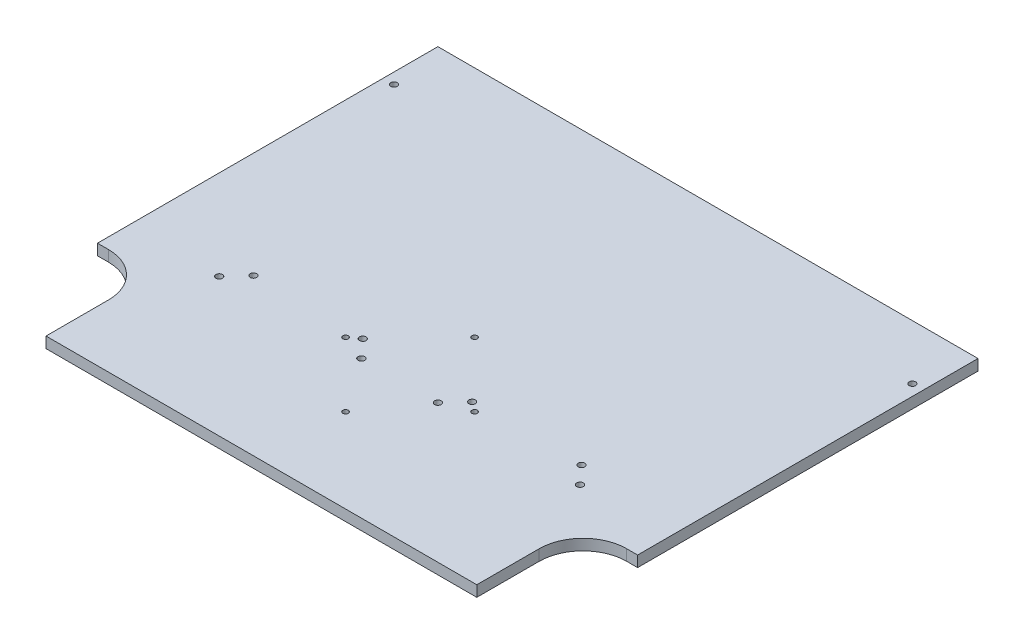
ISO-10303-21;
HEADER;
FILE_DESCRIPTION(('STEP AP214'),'2;1');
FILE_NAME('part.step','',(''),(''),'','','');
FILE_SCHEMA(('AUTOMOTIVE_DESIGN { 1 0 10303 214 1 1 1 1 }'));
ENDSEC;
DATA;
#1=APPLICATION_CONTEXT('core data for automotive mechanical design processes');
#2=APPLICATION_PROTOCOL_DEFINITION('international standard','automotive_design',2000,#1);
#3=PRODUCT_CONTEXT('',#1,'mechanical');
#4=PRODUCT('Part','Part','',(#3));
#5=PRODUCT_RELATED_PRODUCT_CATEGORY('part','',(#4));
#6=PRODUCT_DEFINITION_FORMATION('','',#4);
#7=PRODUCT_DEFINITION_CONTEXT('part definition',#1,'design');
#8=PRODUCT_DEFINITION('design','',#6,#7);
#9=PRODUCT_DEFINITION_SHAPE('','',#8);
#10=(LENGTH_UNIT() NAMED_UNIT(*) SI_UNIT(.MILLI.,.METRE.));
#11=(NAMED_UNIT(*) PLANE_ANGLE_UNIT() SI_UNIT($,.RADIAN.));
#12=(NAMED_UNIT(*) SI_UNIT($,.STERADIAN.) SOLID_ANGLE_UNIT());
#13=UNCERTAINTY_MEASURE_WITH_UNIT(LENGTH_MEASURE(1.E-05),#10,'distance_accuracy_value','');
#14=(GEOMETRIC_REPRESENTATION_CONTEXT(3) GLOBAL_UNCERTAINTY_ASSIGNED_CONTEXT((#13)) GLOBAL_UNIT_ASSIGNED_CONTEXT((#10,
#11,#12)) REPRESENTATION_CONTEXT('',''));
#15=CARTESIAN_POINT('',(0.,0.,0.));
#16=DIRECTION('',(0.,0.,1.));
#17=DIRECTION('',(1.,0.,0.));
#18=AXIS2_PLACEMENT_3D('',#15,#16,#17);
#19=CARTESIAN_POINT('',(123.5,-5.,119.46488064494));
#20=DIRECTION('',(0.,0.,1.));
#21=DIRECTION('',(1.,0.,0.));
#22=AXIS2_PLACEMENT_3D('',#19,#20,#21);
#23=PLANE('',#22);
#24=DIRECTION('',(1.,0.,0.));
#25=VECTOR('',#24,1.);
#26=CARTESIAN_POINT('',(123.5,0.,119.46488064494));
#27=LINE('',#26,#25);
#28=CARTESIAN_POINT('',(118.5,0.,119.46488064494));
#29=VERTEX_POINT('',#28);
#30=CARTESIAN_POINT('',(123.5,0.,119.46488064494));
#31=VERTEX_POINT('',#30);
#32=EDGE_CURVE('E142',#29,#31,#27,.T.);
#33=ORIENTED_EDGE('',*,*,#32,.F.);
#34=DIRECTION('',(0.,1.,0.));
#35=VECTOR('',#34,1.);
#36=CARTESIAN_POINT('',(118.5,-5.,119.46488064494));
#37=LINE('',#36,#35);
#38=CARTESIAN_POINT('',(118.5,-5.,119.46488064494));
#39=VERTEX_POINT('',#38);
#40=EDGE_CURVE('E11',#39,#29,#37,.T.);
#41=ORIENTED_EDGE('',*,*,#40,.F.);
#42=DIRECTION('',(1.,0.,0.));
#43=VECTOR('',#42,1.);
#44=CARTESIAN_POINT('',(123.5,-5.,119.46488064494));
#45=LINE('',#44,#43);
#46=CARTESIAN_POINT('',(123.5,-5.,119.46488064494));
#47=VERTEX_POINT('',#46);
#48=EDGE_CURVE('E169',#39,#47,#45,.T.);
#49=ORIENTED_EDGE('',*,*,#48,.T.);
#50=DIRECTION('',(0.,1.,0.));
#51=VECTOR('',#50,1.);
#52=CARTESIAN_POINT('',(123.5,-5.,119.46488064494));
#53=LINE('',#52,#51);
#54=EDGE_CURVE('E94',#47,#31,#53,.T.);
#55=ORIENTED_EDGE('',*,*,#54,.T.);
#56=EDGE_LOOP('',(#33,#41,#49,#55));
#57=FACE_BOUND('',#56,.T.);
#58=ADVANCED_FACE('F32',(#57),#23,.T.);
#59=CARTESIAN_POINT('',(118.5,-5.,139.46488064494));
#60=DIRECTION('',(0.,1.,0.));
#61=DIRECTION('',(0.,0.,1.));
#62=AXIS2_PLACEMENT_3D('',#59,#60,#61);
#63=CYLINDRICAL_SURFACE('',#62,20.);
#64=CARTESIAN_POINT('',(118.5,0.,139.46488064494));
#65=DIRECTION('',(0.,-1.,0.));
#66=DIRECTION('',(0.,0.,1.));
#67=AXIS2_PLACEMENT_3D('',#64,#65,#66);
#68=CIRCLE('',#67,20.);
#69=CARTESIAN_POINT('',(98.4999999999999,0.,139.46488064494));
#70=VERTEX_POINT('',#69);
#71=EDGE_CURVE('E167',#70,#29,#68,.T.);
#72=ORIENTED_EDGE('',*,*,#71,.F.);
#73=DIRECTION('',(0.,1.,0.));
#74=VECTOR('',#73,1.);
#75=CARTESIAN_POINT('',(98.4999999999999,-5.,139.46488064494));
#76=LINE('',#75,#74);
#77=CARTESIAN_POINT('',(98.4999999999999,-5.,139.46488064494));
#78=VERTEX_POINT('',#77);
#79=EDGE_CURVE('E41',#78,#70,#76,.T.);
#80=ORIENTED_EDGE('',*,*,#79,.F.);
#81=CARTESIAN_POINT('',(118.5,-5.,139.46488064494));
#82=DIRECTION('',(0.,-1.,0.));
#83=DIRECTION('',(0.,0.,1.));
#84=AXIS2_PLACEMENT_3D('',#81,#82,#83);
#85=CIRCLE('',#84,20.);
#86=EDGE_CURVE('E132',#78,#39,#85,.T.);
#87=ORIENTED_EDGE('',*,*,#86,.T.);
#88=ORIENTED_EDGE('',*,*,#40,.T.);
#89=EDGE_LOOP('',(#72,#80,#87,#88));
#90=FACE_BOUND('',#89,.T.);
#91=ADVANCED_FACE('F293',(#90),#63,.F.);
#92=CARTESIAN_POINT('',(98.4999999999999,-5.,139.46488064494));
#93=DIRECTION('',(1.,0.,0.));
#94=DIRECTION('',(0.,0.,-1.));
#95=AXIS2_PLACEMENT_3D('',#92,#93,#94);
#96=PLANE('',#95);
#97=DIRECTION('',(0.,0.,-1.));
#98=VECTOR('',#97,1.);
#99=CARTESIAN_POINT('',(98.4999999999999,0.,139.46488064494));
#100=LINE('',#99,#98);
#101=CARTESIAN_POINT('',(98.4999999999999,0.,168.));
#102=VERTEX_POINT('',#101);
#103=EDGE_CURVE('E119',#102,#70,#100,.T.);
#104=ORIENTED_EDGE('',*,*,#103,.F.);
#105=DIRECTION('',(0.,1.,0.));
#106=VECTOR('',#105,1.);
#107=CARTESIAN_POINT('',(98.4999999999999,-5.,168.));
#108=LINE('',#107,#106);
#109=CARTESIAN_POINT('',(98.4999999999999,-5.,168.));
#110=VERTEX_POINT('',#109);
#111=EDGE_CURVE('E114',#110,#102,#108,.T.);
#112=ORIENTED_EDGE('',*,*,#111,.F.);
#113=DIRECTION('',(0.,0.,-1.));
#114=VECTOR('',#113,1.);
#115=CARTESIAN_POINT('',(98.4999999999999,-5.,139.46488064494));
#116=LINE('',#115,#114);
#117=EDGE_CURVE('E117',#110,#78,#116,.T.);
#118=ORIENTED_EDGE('',*,*,#117,.T.);
#119=ORIENTED_EDGE('',*,*,#79,.T.);
#120=EDGE_LOOP('',(#104,#112,#118,#119));
#121=FACE_BOUND('',#120,.T.);
#122=ADVANCED_FACE('F116',(#121),#96,.T.);
#123=CARTESIAN_POINT('',(98.4999999999999,-5.,168.));
#124=DIRECTION('',(0.,0.,1.));
#125=DIRECTION('',(1.,0.,0.));
#126=AXIS2_PLACEMENT_3D('',#123,#124,#125);
#127=PLANE('',#126);
#128=DIRECTION('',(1.,0.,0.));
#129=VECTOR('',#128,1.);
#130=CARTESIAN_POINT('',(98.4999999999999,0.,168.));
#131=LINE('',#130,#129);
#132=CARTESIAN_POINT('',(-98.4999999999998,0.,168.));
#133=VERTEX_POINT('',#132);
#134=EDGE_CURVE('E164',#133,#102,#131,.T.);
#135=ORIENTED_EDGE('',*,*,#134,.F.);
#136=DIRECTION('',(0.,1.,0.));
#137=VECTOR('',#136,1.);
#138=CARTESIAN_POINT('',(-98.4999999999998,-5.,168.));
#139=LINE('',#138,#137);
#140=CARTESIAN_POINT('',(-98.4999999999998,-5.,168.));
#141=VERTEX_POINT('',#140);
#142=EDGE_CURVE('E124',#141,#133,#139,.T.);
#143=ORIENTED_EDGE('',*,*,#142,.F.);
#144=DIRECTION('',(1.,0.,0.));
#145=VECTOR('',#144,1.);
#146=CARTESIAN_POINT('',(98.4999999999999,-5.,168.));
#147=LINE('',#146,#145);
#148=EDGE_CURVE('E130',#141,#110,#147,.T.);
#149=ORIENTED_EDGE('',*,*,#148,.T.);
#150=ORIENTED_EDGE('',*,*,#111,.T.);
#151=EDGE_LOOP('',(#135,#143,#149,#150));
#152=FACE_BOUND('',#151,.T.);
#153=ADVANCED_FACE('F134',(#152),#127,.T.);
#154=CARTESIAN_POINT('',(-98.4999999999998,-5.,168.));
#155=DIRECTION('',(-1.,0.,0.));
#156=DIRECTION('',(0.,0.,1.));
#157=AXIS2_PLACEMENT_3D('',#154,#155,#156);
#158=PLANE('',#157);
#159=DIRECTION('',(0.,0.,1.));
#160=VECTOR('',#159,1.);
#161=CARTESIAN_POINT('',(-98.4999999999998,0.,168.));
#162=LINE('',#161,#160);
#163=CARTESIAN_POINT('',(-98.4999999999998,0.,139.46488064494));
#164=VERTEX_POINT('',#163);
#165=EDGE_CURVE('E161',#164,#133,#162,.T.);
#166=ORIENTED_EDGE('',*,*,#165,.F.);
#167=DIRECTION('',(0.,1.,0.));
#168=VECTOR('',#167,1.);
#169=CARTESIAN_POINT('',(-98.4999999999998,-5.,139.46488064494));
#170=LINE('',#169,#168);
#171=CARTESIAN_POINT('',(-98.4999999999998,-5.,139.46488064494));
#172=VERTEX_POINT('',#171);
#173=EDGE_CURVE('E173',#172,#164,#170,.T.);
#174=ORIENTED_EDGE('',*,*,#173,.F.);
#175=DIRECTION('',(0.,0.,1.));
#176=VECTOR('',#175,1.);
#177=CARTESIAN_POINT('',(-98.4999999999998,-5.,168.));
#178=LINE('',#177,#176);
#179=EDGE_CURVE('E135',#172,#141,#178,.T.);
#180=ORIENTED_EDGE('',*,*,#179,.T.);
#181=ORIENTED_EDGE('',*,*,#142,.T.);
#182=EDGE_LOOP('',(#166,#174,#180,#181));
#183=FACE_BOUND('',#182,.T.);
#184=ADVANCED_FACE('F306',(#183),#158,.T.);
#185=CARTESIAN_POINT('',(-118.5,-5.,139.46488064494));
#186=DIRECTION('',(0.,1.,0.));
#187=DIRECTION('',(0.,0.,1.));
#188=AXIS2_PLACEMENT_3D('',#185,#186,#187);
#189=CYLINDRICAL_SURFACE('',#188,20.);
#190=CARTESIAN_POINT('',(-118.5,0.,139.46488064494));
#191=DIRECTION('',(0.,-1.,0.));
#192=DIRECTION('',(0.,0.,1.));
#193=AXIS2_PLACEMENT_3D('',#190,#191,#192);
#194=CIRCLE('',#193,20.);
#195=CARTESIAN_POINT('',(-118.5,0.,119.46488064494));
#196=VERTEX_POINT('',#195);
#197=EDGE_CURVE('E158',#196,#164,#194,.T.);
#198=ORIENTED_EDGE('',*,*,#197,.F.);
#199=DIRECTION('',(0.,1.,0.));
#200=VECTOR('',#199,1.);
#201=CARTESIAN_POINT('',(-118.5,-5.,119.46488064494));
#202=LINE('',#201,#200);
#203=CARTESIAN_POINT('',(-118.5,-5.,119.46488064494));
#204=VERTEX_POINT('',#203);
#205=EDGE_CURVE('E175',#204,#196,#202,.T.);
#206=ORIENTED_EDGE('',*,*,#205,.F.);
#207=CARTESIAN_POINT('',(-118.5,-5.,139.46488064494));
#208=DIRECTION('',(0.,-1.,0.));
#209=DIRECTION('',(0.,0.,1.));
#210=AXIS2_PLACEMENT_3D('',#207,#208,#209);
#211=CIRCLE('',#210,20.);
#212=EDGE_CURVE('E137',#204,#172,#211,.T.);
#213=ORIENTED_EDGE('',*,*,#212,.T.);
#214=ORIENTED_EDGE('',*,*,#173,.T.);
#215=EDGE_LOOP('',(#198,#206,#213,#214));
#216=FACE_BOUND('',#215,.T.);
#217=ADVANCED_FACE('F276',(#216),#189,.F.);
#218=CARTESIAN_POINT('',(-118.5,-5.,119.46488064494));
#219=DIRECTION('',(0.,0.,1.));
#220=DIRECTION('',(1.,0.,0.));
#221=AXIS2_PLACEMENT_3D('',#218,#219,#220);
#222=PLANE('',#221);
#223=DIRECTION('',(1.,0.,0.));
#224=VECTOR('',#223,1.);
#225=CARTESIAN_POINT('',(-118.5,0.,119.46488064494));
#226=LINE('',#225,#224);
#227=CARTESIAN_POINT('',(-123.5,0.,119.46488064494));
#228=VERTEX_POINT('',#227);
#229=EDGE_CURVE('E155',#228,#196,#226,.T.);
#230=ORIENTED_EDGE('',*,*,#229,.F.);
#231=DIRECTION('',(0.,1.,0.));
#232=VECTOR('',#231,1.);
#233=CARTESIAN_POINT('',(-123.5,-5.,119.46488064494));
#234=LINE('',#233,#232);
#235=CARTESIAN_POINT('',(-123.5,-5.,119.46488064494));
#236=VERTEX_POINT('',#235);
#237=EDGE_CURVE('E177',#236,#228,#234,.T.);
#238=ORIENTED_EDGE('',*,*,#237,.F.);
#239=DIRECTION('',(1.,0.,0.));
#240=VECTOR('',#239,1.);
#241=CARTESIAN_POINT('',(-118.5,-5.,119.46488064494));
#242=LINE('',#241,#240);
#243=EDGE_CURVE('E270',#236,#204,#242,.T.);
#244=ORIENTED_EDGE('',*,*,#243,.T.);
#245=ORIENTED_EDGE('',*,*,#205,.T.);
#246=EDGE_LOOP('',(#230,#238,#244,#245));
#247=FACE_BOUND('',#246,.T.);
#248=ADVANCED_FACE('F282',(#247),#222,.T.);
#249=CARTESIAN_POINT('',(-123.5,-5.,119.46488064494));
#250=DIRECTION('',(-1.,0.,0.));
#251=DIRECTION('',(0.,0.,1.));
#252=AXIS2_PLACEMENT_3D('',#249,#250,#251);
#253=PLANE('',#252);
#254=DIRECTION('',(0.,0.,1.));
#255=VECTOR('',#254,1.);
#256=CARTESIAN_POINT('',(-123.5,0.,119.46488064494));
#257=LINE('',#256,#255);
#258=CARTESIAN_POINT('',(-123.5,0.,-36.1999999999999));
#259=VERTEX_POINT('',#258);
#260=EDGE_CURVE('E152',#259,#228,#257,.T.);
#261=ORIENTED_EDGE('',*,*,#260,.F.);
#262=DIRECTION('',(0.,1.,0.));
#263=VECTOR('',#262,1.);
#264=CARTESIAN_POINT('',(-123.5,-5.,-36.1999999999999));
#265=LINE('',#264,#263);
#266=CARTESIAN_POINT('',(-123.5,-5.,-36.1999999999999));
#267=VERTEX_POINT('',#266);
#268=EDGE_CURVE('E179',#267,#259,#265,.T.);
#269=ORIENTED_EDGE('',*,*,#268,.F.);
#270=DIRECTION('',(0.,0.,1.));
#271=VECTOR('',#270,1.);
#272=CARTESIAN_POINT('',(-123.5,-5.,119.46488064494));
#273=LINE('',#272,#271);
#274=EDGE_CURVE('E267',#267,#236,#273,.T.);
#275=ORIENTED_EDGE('',*,*,#274,.T.);
#276=ORIENTED_EDGE('',*,*,#237,.T.);
#277=EDGE_LOOP('',(#261,#269,#275,#276));
#278=FACE_BOUND('',#277,.T.);
#279=ADVANCED_FACE('F285',(#278),#253,.T.);
#280=CARTESIAN_POINT('',(123.5,-5.,-36.2));
#281=DIRECTION('',(0.,0.,-1.));
#282=DIRECTION('',(-1.,0.,0.));
#283=AXIS2_PLACEMENT_3D('',#280,#281,#282);
#284=PLANE('',#283);
#285=DIRECTION('',(-1.,0.,0.));
#286=VECTOR('',#285,1.);
#287=CARTESIAN_POINT('',(123.5,0.,-36.2));
#288=LINE('',#287,#286);
#289=CARTESIAN_POINT('',(123.5,0.,-36.2));
#290=VERTEX_POINT('',#289);
#291=EDGE_CURVE('E149',#290,#259,#288,.T.);
#292=ORIENTED_EDGE('',*,*,#291,.F.);
#293=DIRECTION('',(0.,1.,0.));
#294=VECTOR('',#293,1.);
#295=CARTESIAN_POINT('',(123.5,-5.,-36.2));
#296=LINE('',#295,#294);
#297=CARTESIAN_POINT('',(123.5,-5.,-36.2));
#298=VERTEX_POINT('',#297);
#299=EDGE_CURVE('E181',#298,#290,#296,.T.);
#300=ORIENTED_EDGE('',*,*,#299,.F.);
#301=DIRECTION('',(-1.,0.,0.));
#302=VECTOR('',#301,1.);
#303=CARTESIAN_POINT('',(123.5,-5.,-36.2));
#304=LINE('',#303,#302);
#305=EDGE_CURVE('E264',#298,#267,#304,.T.);
#306=ORIENTED_EDGE('',*,*,#305,.T.);
#307=ORIENTED_EDGE('',*,*,#268,.T.);
#308=EDGE_LOOP('',(#292,#300,#306,#307));
#309=FACE_BOUND('',#308,.T.);
#310=ADVANCED_FACE('F289',(#309),#284,.T.);
#311=CARTESIAN_POINT('',(123.5,-5.,119.46488064494));
#312=DIRECTION('',(1.,0.,0.));
#313=DIRECTION('',(0.,0.,-1.));
#314=AXIS2_PLACEMENT_3D('',#311,#312,#313);
#315=PLANE('',#314);
#316=DIRECTION('',(0.,0.,-1.));
#317=VECTOR('',#316,1.);
#318=CARTESIAN_POINT('',(123.5,0.,119.46488064494));
#319=LINE('',#318,#317);
#320=EDGE_CURVE('E145',#31,#290,#319,.T.);
#321=ORIENTED_EDGE('',*,*,#320,.F.);
#322=ORIENTED_EDGE('',*,*,#54,.F.);
#323=DIRECTION('',(0.,0.,-1.));
#324=VECTOR('',#323,1.);
#325=CARTESIAN_POINT('',(123.5,-5.,119.46488064494));
#326=LINE('',#325,#324);
#327=EDGE_CURVE('E262',#47,#298,#326,.T.);
#328=ORIENTED_EDGE('',*,*,#327,.T.);
#329=ORIENTED_EDGE('',*,*,#299,.T.);
#330=EDGE_LOOP('',(#321,#322,#328,#329));
#331=FACE_BOUND('',#330,.T.);
#332=ADVANCED_FACE('F290',(#331),#315,.T.);
#333=CARTESIAN_POINT('',(118.5,-5.,139.46488064494));
#334=DIRECTION('',(0.,1.,0.));
#335=DIRECTION('',(0.,0.,1.));
#336=AXIS2_PLACEMENT_3D('',#333,#334,#335);
#337=PLANE('',#336);
#338=CARTESIAN_POINT('',(-25.,-5.,96.9522206596994));
#339=DIRECTION('',(0.,1.,0.));
#340=DIRECTION('',(0.,0.,1.));
#341=AXIS2_PLACEMENT_3D('',#338,#339,#340);
#342=ELLIPSE('',#341,1.50292683205138,1.5);
#343=CARTESIAN_POINT('',(-25.,-5.,98.4551474917508));
#344=VERTEX_POINT('',#343);
#345=EDGE_CURVE('E188',#344,#344,#342,.F.);
#346=ORIENTED_EDGE('',*,*,#345,.F.);
#347=EDGE_LOOP('',(#346));
#348=FACE_BOUND('',#347,.T.);
#349=CARTESIAN_POINT('',(-82.5,-5.,105.100000868297));
#350=DIRECTION('',(0.,1.,0.));
#351=DIRECTION('',(0.,0.,1.));
#352=AXIS2_PLACEMENT_3D('',#349,#350,#351);
#353=ELLIPSE('',#352,1.50292683205138,1.5);
#354=CARTESIAN_POINT('',(-82.5,-5.,106.602927700348));
#355=VERTEX_POINT('',#354);
#356=EDGE_CURVE('E210',#355,#355,#353,.F.);
#357=ORIENTED_EDGE('',*,*,#356,.F.);
#358=EDGE_LOOP('',(#357));
#359=FACE_BOUND('',#358,.T.);
#360=CARTESIAN_POINT('',(-75.,-5.,96.9522206596994));
#361=DIRECTION('',(0.,1.,0.));
#362=DIRECTION('',(0.,0.,1.));
#363=AXIS2_PLACEMENT_3D('',#360,#361,#362);
#364=ELLIPSE('',#363,1.50292683205136,1.49999999999998);
#365=CARTESIAN_POINT('',(-75.,-5.,98.4551474917507));
#366=VERTEX_POINT('',#365);
#367=EDGE_CURVE('E207',#366,#366,#364,.F.);
#368=ORIENTED_EDGE('',*,*,#367,.F.);
#369=EDGE_LOOP('',(#368));
#370=FACE_BOUND('',#369,.T.);
#371=CARTESIAN_POINT('',(17.5,-5.,105.100000868297));
#372=DIRECTION('',(0.,1.,0.));
#373=DIRECTION('',(0.,0.,1.));
#374=AXIS2_PLACEMENT_3D('',#371,#372,#373);
#375=ELLIPSE('',#374,1.5029268320514,1.50000000000002);
#376=CARTESIAN_POINT('',(17.5,-5.,106.602927700348));
#377=VERTEX_POINT('',#376);
#378=EDGE_CURVE('E204',#377,#377,#375,.F.);
#379=ORIENTED_EDGE('',*,*,#378,.F.);
#380=EDGE_LOOP('',(#379));
#381=FACE_BOUND('',#380,.T.);
#382=CARTESIAN_POINT('',(25.,-5.,96.9522206596994));
#383=DIRECTION('',(0.,1.,0.));
#384=DIRECTION('',(0.,0.,1.));
#385=AXIS2_PLACEMENT_3D('',#382,#383,#384);
#386=ELLIPSE('',#385,1.50292683205139,1.50000000000001);
#387=CARTESIAN_POINT('',(25.,-5.,98.4551474917508));
#388=VERTEX_POINT('',#387);
#389=EDGE_CURVE('E200',#388,#388,#386,.F.);
#390=ORIENTED_EDGE('',*,*,#389,.F.);
#391=EDGE_LOOP('',(#390));
#392=FACE_BOUND('',#391,.T.);
#393=CARTESIAN_POINT('',(75.,-5.,96.9522206596994));
#394=DIRECTION('',(0.,1.,0.));
#395=DIRECTION('',(0.,0.,1.));
#396=AXIS2_PLACEMENT_3D('',#393,#394,#395);
#397=ELLIPSE('',#396,1.50292683205138,1.5);
#398=CARTESIAN_POINT('',(75.,-5.,98.4551474917508));
#399=VERTEX_POINT('',#398);
#400=EDGE_CURVE('E196',#399,#399,#397,.F.);
#401=ORIENTED_EDGE('',*,*,#400,.F.);
#402=EDGE_LOOP('',(#401));
#403=FACE_BOUND('',#402,.T.);
#404=CARTESIAN_POINT('',(82.5,-5.,105.100000868297));
#405=DIRECTION('',(0.,1.,0.));
#406=DIRECTION('',(0.,0.,1.));
#407=AXIS2_PLACEMENT_3D('',#404,#405,#406);
#408=ELLIPSE('',#407,1.50292683205138,1.5);
#409=CARTESIAN_POINT('',(82.5,-5.,106.602927700348));
#410=VERTEX_POINT('',#409);
#411=EDGE_CURVE('E192',#410,#410,#408,.F.);
#412=ORIENTED_EDGE('',*,*,#411,.F.);
#413=EDGE_LOOP('',(#412));
#414=FACE_BOUND('',#413,.T.);
#415=CARTESIAN_POINT('',(-17.5,-5.,105.100000868297));
#416=DIRECTION('',(0.,1.,0.));
#417=DIRECTION('',(0.,0.,1.));
#418=AXIS2_PLACEMENT_3D('',#415,#416,#417);
#419=ELLIPSE('',#418,1.50292683205138,1.5);
#420=CARTESIAN_POINT('',(-17.5,-5.,106.602927700348));
#421=VERTEX_POINT('',#420);
#422=EDGE_CURVE('E187',#421,#421,#419,.F.);
#423=ORIENTED_EDGE('',*,*,#422,.F.);
#424=EDGE_LOOP('',(#423));
#425=FACE_BOUND('',#424,.T.);
#426=CARTESIAN_POINT('',(0.,-5.,70.5000000000044));
#427=DIRECTION('',(0.,1.,0.));
#428=DIRECTION('',(0.,0.,1.));
#429=AXIS2_PLACEMENT_3D('',#426,#427,#428);
#430=CIRCLE('',#429,1.25);
#431=CARTESIAN_POINT('',(0.,-5.,71.7500000000044));
#432=VERTEX_POINT('',#431);
#433=EDGE_CURVE('E227',#432,#432,#430,.T.);
#434=ORIENTED_EDGE('',*,*,#433,.T.);
#435=EDGE_LOOP('',(#434));
#436=FACE_BOUND('',#435,.T.);
#437=CARTESIAN_POINT('',(-29.4999999999956,-5.,100.));
#438=DIRECTION('',(0.,1.,0.));
#439=DIRECTION('',(0.,0.,1.));
#440=AXIS2_PLACEMENT_3D('',#437,#438,#439);
#441=CIRCLE('',#440,1.25);
#442=CARTESIAN_POINT('',(-29.4999999999956,-5.,101.25));
#443=VERTEX_POINT('',#442);
#444=EDGE_CURVE('E233',#443,#443,#441,.T.);
#445=ORIENTED_EDGE('',*,*,#444,.T.);
#446=EDGE_LOOP('',(#445));
#447=FACE_BOUND('',#446,.T.);
#448=CARTESIAN_POINT('',(29.4999999999956,-5.,100.));
#449=DIRECTION('',(0.,1.,0.));
#450=DIRECTION('',(0.,0.,1.));
#451=AXIS2_PLACEMENT_3D('',#448,#449,#450);
#452=CIRCLE('',#451,1.25);
#453=CARTESIAN_POINT('',(29.4999999999956,-5.,101.25));
#454=VERTEX_POINT('',#453);
#455=EDGE_CURVE('E239',#454,#454,#452,.T.);
#456=ORIENTED_EDGE('',*,*,#455,.T.);
#457=EDGE_LOOP('',(#456));
#458=FACE_BOUND('',#457,.T.);
#459=CARTESIAN_POINT('',(0.,-5.,129.499999999996));
#460=DIRECTION('',(0.,1.,0.));
#461=DIRECTION('',(0.,0.,1.));
#462=AXIS2_PLACEMENT_3D('',#459,#460,#461);
#463=CIRCLE('',#462,1.25);
#464=CARTESIAN_POINT('',(0.,-5.,130.749999999996));
#465=VERTEX_POINT('',#464);
#466=EDGE_CURVE('E245',#465,#465,#463,.T.);
#467=ORIENTED_EDGE('',*,*,#466,.T.);
#468=EDGE_LOOP('',(#467));
#469=FACE_BOUND('',#468,.T.);
#470=CARTESIAN_POINT('',(118.5,-5.,-11.2));
#471=DIRECTION('',(0.,1.,0.));
#472=DIRECTION('',(0.,0.,1.));
#473=AXIS2_PLACEMENT_3D('',#470,#471,#472);
#474=CIRCLE('',#473,1.5);
#475=CARTESIAN_POINT('',(118.5,-5.,-9.7));
#476=VERTEX_POINT('',#475);
#477=EDGE_CURVE('E251',#476,#476,#474,.T.);
#478=ORIENTED_EDGE('',*,*,#477,.T.);
#479=EDGE_LOOP('',(#478));
#480=FACE_BOUND('',#479,.T.);
#481=CARTESIAN_POINT('',(-118.5,-5.,-11.2));
#482=DIRECTION('',(0.,1.,0.));
#483=DIRECTION('',(0.,0.,1.));
#484=AXIS2_PLACEMENT_3D('',#481,#482,#483);
#485=CIRCLE('',#484,1.5);
#486=CARTESIAN_POINT('',(-118.5,-5.,-9.70000000000001));
#487=VERTEX_POINT('',#486);
#488=EDGE_CURVE('E146',#487,#487,#485,.T.);
#489=ORIENTED_EDGE('',*,*,#488,.T.);
#490=EDGE_LOOP('',(#489));
#491=FACE_BOUND('',#490,.T.);
#492=ORIENTED_EDGE('',*,*,#48,.F.);
#493=ORIENTED_EDGE('',*,*,#86,.F.);
#494=ORIENTED_EDGE('',*,*,#117,.F.);
#495=ORIENTED_EDGE('',*,*,#148,.F.);
#496=ORIENTED_EDGE('',*,*,#179,.F.);
#497=ORIENTED_EDGE('',*,*,#212,.F.);
#498=ORIENTED_EDGE('',*,*,#243,.F.);
#499=ORIENTED_EDGE('',*,*,#274,.F.);
#500=ORIENTED_EDGE('',*,*,#305,.F.);
#501=ORIENTED_EDGE('',*,*,#327,.F.);
#502=EDGE_LOOP('',(#492,#493,#494,#495,#496,#497,#498,#499,#500,#501));
#503=FACE_BOUND('',#502,.T.);
#504=ADVANCED_FACE('F128',(#348,#359,#370,#381,#392,#403,#414,#425,#436,#447,#458,#469,#480,
#491,#503),#337,.F.);
#505=CARTESIAN_POINT('',(118.5,0.,139.46488064494));
#506=DIRECTION('',(0.,1.,0.));
#507=DIRECTION('',(0.,0.,1.));
#508=AXIS2_PLACEMENT_3D('',#505,#506,#507);
#509=PLANE('',#508);
#510=CARTESIAN_POINT('',(-25.,0.,96.6397206596994));
#511=DIRECTION('',(0.,1.,0.));
#512=DIRECTION('',(0.,0.,1.));
#513=AXIS2_PLACEMENT_3D('',#510,#511,#512);
#514=ELLIPSE('',#513,1.50292683205138,1.5);
#515=CARTESIAN_POINT('',(-25.,0.,98.1426474917508));
#516=VERTEX_POINT('',#515);
#517=EDGE_CURVE('E35',#516,#516,#514,.F.);
#518=ORIENTED_EDGE('',*,*,#517,.T.);
#519=EDGE_LOOP('',(#518));
#520=FACE_BOUND('',#519,.T.);
#521=CARTESIAN_POINT('',(-82.5,0.,104.787500868297));
#522=DIRECTION('',(0.,1.,0.));
#523=DIRECTION('',(0.,0.,1.));
#524=AXIS2_PLACEMENT_3D('',#521,#522,#523);
#525=ELLIPSE('',#524,1.50292683205138,1.5);
#526=CARTESIAN_POINT('',(-82.5,0.,106.290427700348));
#527=VERTEX_POINT('',#526);
#528=EDGE_CURVE('E208',#527,#527,#525,.F.);
#529=ORIENTED_EDGE('',*,*,#528,.T.);
#530=EDGE_LOOP('',(#529));
#531=FACE_BOUND('',#530,.T.);
#532=CARTESIAN_POINT('',(-75.,0.,96.6397206596994));
#533=DIRECTION('',(0.,1.,0.));
#534=DIRECTION('',(0.,0.,1.));
#535=AXIS2_PLACEMENT_3D('',#532,#533,#534);
#536=ELLIPSE('',#535,1.50292683205136,1.49999999999998);
#537=CARTESIAN_POINT('',(-75.,0.,98.1426474917507));
#538=VERTEX_POINT('',#537);
#539=EDGE_CURVE('E205',#538,#538,#536,.F.);
#540=ORIENTED_EDGE('',*,*,#539,.T.);
#541=EDGE_LOOP('',(#540));
#542=FACE_BOUND('',#541,.T.);
#543=CARTESIAN_POINT('',(17.5,0.,104.787500868297));
#544=DIRECTION('',(0.,1.,0.));
#545=DIRECTION('',(0.,0.,1.));
#546=AXIS2_PLACEMENT_3D('',#543,#544,#545);
#547=ELLIPSE('',#546,1.5029268320514,1.50000000000002);
#548=CARTESIAN_POINT('',(17.5,0.,106.290427700348));
#549=VERTEX_POINT('',#548);
#550=EDGE_CURVE('E201',#549,#549,#547,.F.);
#551=ORIENTED_EDGE('',*,*,#550,.T.);
#552=EDGE_LOOP('',(#551));
#553=FACE_BOUND('',#552,.T.);
#554=CARTESIAN_POINT('',(25.,0.,96.6397206596994));
#555=DIRECTION('',(0.,1.,0.));
#556=DIRECTION('',(0.,0.,1.));
#557=AXIS2_PLACEMENT_3D('',#554,#555,#556);
#558=ELLIPSE('',#557,1.50292683205139,1.50000000000001);
#559=CARTESIAN_POINT('',(25.,0.,98.1426474917508));
#560=VERTEX_POINT('',#559);
#561=EDGE_CURVE('E197',#560,#560,#558,.F.);
#562=ORIENTED_EDGE('',*,*,#561,.T.);
#563=EDGE_LOOP('',(#562));
#564=FACE_BOUND('',#563,.T.);
#565=CARTESIAN_POINT('',(75.,0.,96.6397206596994));
#566=DIRECTION('',(0.,1.,0.));
#567=DIRECTION('',(0.,0.,1.));
#568=AXIS2_PLACEMENT_3D('',#565,#566,#567);
#569=ELLIPSE('',#568,1.50292683205138,1.5);
#570=CARTESIAN_POINT('',(75.,0.,98.1426474917508));
#571=VERTEX_POINT('',#570);
#572=EDGE_CURVE('E193',#571,#571,#569,.F.);
#573=ORIENTED_EDGE('',*,*,#572,.T.);
#574=EDGE_LOOP('',(#573));
#575=FACE_BOUND('',#574,.T.);
#576=CARTESIAN_POINT('',(82.5,0.,104.787500868297));
#577=DIRECTION('',(0.,1.,0.));
#578=DIRECTION('',(0.,0.,1.));
#579=AXIS2_PLACEMENT_3D('',#576,#577,#578);
#580=ELLIPSE('',#579,1.50292683205138,1.5);
#581=CARTESIAN_POINT('',(82.5,0.,106.290427700348));
#582=VERTEX_POINT('',#581);
#583=EDGE_CURVE('E189',#582,#582,#580,.F.);
#584=ORIENTED_EDGE('',*,*,#583,.T.);
#585=EDGE_LOOP('',(#584));
#586=FACE_BOUND('',#585,.T.);
#587=CARTESIAN_POINT('',(-17.5,0.,104.787500868297));
#588=DIRECTION('',(0.,1.,0.));
#589=DIRECTION('',(0.,0.,1.));
#590=AXIS2_PLACEMENT_3D('',#587,#588,#589);
#591=ELLIPSE('',#590,1.50292683205138,1.5);
#592=CARTESIAN_POINT('',(-17.5,0.,106.290427700348));
#593=VERTEX_POINT('',#592);
#594=EDGE_CURVE('E184',#593,#593,#591,.F.);
#595=ORIENTED_EDGE('',*,*,#594,.T.);
#596=EDGE_LOOP('',(#595));
#597=FACE_BOUND('',#596,.T.);
#598=CARTESIAN_POINT('',(0.,0.,70.5000000000044));
#599=DIRECTION('',(0.,1.,0.));
#600=DIRECTION('',(0.,0.,1.));
#601=AXIS2_PLACEMENT_3D('',#598,#599,#600);
#602=CIRCLE('',#601,1.25);
#603=CARTESIAN_POINT('',(0.,0.,71.7500000000044));
#604=VERTEX_POINT('',#603);
#605=EDGE_CURVE('E226',#604,#604,#602,.T.);
#606=ORIENTED_EDGE('',*,*,#605,.F.);
#607=EDGE_LOOP('',(#606));
#608=FACE_BOUND('',#607,.T.);
#609=CARTESIAN_POINT('',(-29.4999999999956,0.,100.));
#610=DIRECTION('',(0.,1.,0.));
#611=DIRECTION('',(0.,0.,1.));
#612=AXIS2_PLACEMENT_3D('',#609,#610,#611);
#613=CIRCLE('',#612,1.25);
#614=CARTESIAN_POINT('',(-29.4999999999956,0.,101.25));
#615=VERTEX_POINT('',#614);
#616=EDGE_CURVE('E230',#615,#615,#613,.T.);
#617=ORIENTED_EDGE('',*,*,#616,.F.);
#618=EDGE_LOOP('',(#617));
#619=FACE_BOUND('',#618,.T.);
#620=CARTESIAN_POINT('',(29.4999999999956,0.,100.));
#621=DIRECTION('',(0.,1.,0.));
#622=DIRECTION('',(0.,0.,1.));
#623=AXIS2_PLACEMENT_3D('',#620,#621,#622);
#624=CIRCLE('',#623,1.25);
#625=CARTESIAN_POINT('',(29.4999999999956,0.,101.25));
#626=VERTEX_POINT('',#625);
#627=EDGE_CURVE('E236',#626,#626,#624,.T.);
#628=ORIENTED_EDGE('',*,*,#627,.F.);
#629=EDGE_LOOP('',(#628));
#630=FACE_BOUND('',#629,.T.);
#631=CARTESIAN_POINT('',(0.,0.,129.499999999996));
#632=DIRECTION('',(0.,1.,0.));
#633=DIRECTION('',(0.,0.,1.));
#634=AXIS2_PLACEMENT_3D('',#631,#632,#633);
#635=CIRCLE('',#634,1.25);
#636=CARTESIAN_POINT('',(0.,0.,130.749999999996));
#637=VERTEX_POINT('',#636);
#638=EDGE_CURVE('E242',#637,#637,#635,.T.);
#639=ORIENTED_EDGE('',*,*,#638,.F.);
#640=EDGE_LOOP('',(#639));
#641=FACE_BOUND('',#640,.T.);
#642=CARTESIAN_POINT('',(118.5,0.,-11.2));
#643=DIRECTION('',(0.,1.,0.));
#644=DIRECTION('',(0.,0.,1.));
#645=AXIS2_PLACEMENT_3D('',#642,#643,#644);
#646=CIRCLE('',#645,1.5);
#647=CARTESIAN_POINT('',(118.5,0.,-9.7));
#648=VERTEX_POINT('',#647);
#649=EDGE_CURVE('E248',#648,#648,#646,.T.);
#650=ORIENTED_EDGE('',*,*,#649,.F.);
#651=EDGE_LOOP('',(#650));
#652=FACE_BOUND('',#651,.T.);
#653=CARTESIAN_POINT('',(-118.5,0.,-11.2));
#654=DIRECTION('',(0.,1.,0.));
#655=DIRECTION('',(0.,0.,1.));
#656=AXIS2_PLACEMENT_3D('',#653,#654,#655);
#657=CIRCLE('',#656,1.5);
#658=CARTESIAN_POINT('',(-118.5,0.,-9.70000000000001));
#659=VERTEX_POINT('',#658);
#660=EDGE_CURVE('E254',#659,#659,#657,.T.);
#661=ORIENTED_EDGE('',*,*,#660,.F.);
#662=EDGE_LOOP('',(#661));
#663=FACE_BOUND('',#662,.T.);
#664=ORIENTED_EDGE('',*,*,#32,.T.);
#665=ORIENTED_EDGE('',*,*,#320,.T.);
#666=ORIENTED_EDGE('',*,*,#291,.T.);
#667=ORIENTED_EDGE('',*,*,#260,.T.);
#668=ORIENTED_EDGE('',*,*,#229,.T.);
#669=ORIENTED_EDGE('',*,*,#197,.T.);
#670=ORIENTED_EDGE('',*,*,#165,.T.);
#671=ORIENTED_EDGE('',*,*,#134,.T.);
#672=ORIENTED_EDGE('',*,*,#103,.T.);
#673=ORIENTED_EDGE('',*,*,#71,.T.);
#674=EDGE_LOOP('',(#664,#665,#666,#667,#668,#669,#670,#671,#672,#673));
#675=FACE_BOUND('',#674,.T.);
#676=ADVANCED_FACE('F292',(#520,#531,#542,#553,#564,#575,#586,#597,#608,#619,#630,#641,#652,
#663,#675),#509,.T.);
#677=CARTESIAN_POINT('',(-118.5,-5.,-11.2));
#678=DIRECTION('',(0.,1.,0.));
#679=DIRECTION('',(0.,0.,1.));
#680=AXIS2_PLACEMENT_3D('',#677,#678,#679);
#681=CYLINDRICAL_SURFACE('',#680,1.5);
#682=ORIENTED_EDGE('',*,*,#488,.F.);
#683=EDGE_LOOP('',(#682));
#684=FACE_BOUND('',#683,.T.);
#685=ORIENTED_EDGE('',*,*,#660,.T.);
#686=EDGE_LOOP('',(#685));
#687=FACE_BOUND('',#686,.T.);
#688=ADVANCED_FACE('F325',(#684,#687),#681,.F.);
#689=CARTESIAN_POINT('',(118.5,-5.,-11.2));
#690=DIRECTION('',(0.,1.,0.));
#691=DIRECTION('',(0.,0.,1.));
#692=AXIS2_PLACEMENT_3D('',#689,#690,#691);
#693=CYLINDRICAL_SURFACE('',#692,1.5);
#694=ORIENTED_EDGE('',*,*,#477,.F.);
#695=EDGE_LOOP('',(#694));
#696=FACE_BOUND('',#695,.T.);
#697=ORIENTED_EDGE('',*,*,#649,.T.);
#698=EDGE_LOOP('',(#697));
#699=FACE_BOUND('',#698,.T.);
#700=ADVANCED_FACE('F332',(#696,#699),#693,.F.);
#701=CARTESIAN_POINT('',(0.,-5.,129.499999999996));
#702=DIRECTION('',(0.,1.,0.));
#703=DIRECTION('',(0.,0.,1.));
#704=AXIS2_PLACEMENT_3D('',#701,#702,#703);
#705=CYLINDRICAL_SURFACE('',#704,1.25);
#706=ORIENTED_EDGE('',*,*,#466,.F.);
#707=EDGE_LOOP('',(#706));
#708=FACE_BOUND('',#707,.T.);
#709=ORIENTED_EDGE('',*,*,#638,.T.);
#710=EDGE_LOOP('',(#709));
#711=FACE_BOUND('',#710,.T.);
#712=ADVANCED_FACE('F336',(#708,#711),#705,.F.);
#713=CARTESIAN_POINT('',(29.4999999999956,-5.,100.));
#714=DIRECTION('',(0.,1.,0.));
#715=DIRECTION('',(0.,0.,1.));
#716=AXIS2_PLACEMENT_3D('',#713,#714,#715);
#717=CYLINDRICAL_SURFACE('',#716,1.25);
#718=ORIENTED_EDGE('',*,*,#455,.F.);
#719=EDGE_LOOP('',(#718));
#720=FACE_BOUND('',#719,.T.);
#721=ORIENTED_EDGE('',*,*,#627,.T.);
#722=EDGE_LOOP('',(#721));
#723=FACE_BOUND('',#722,.T.);
#724=ADVANCED_FACE('F340',(#720,#723),#717,.F.);
#725=CARTESIAN_POINT('',(-29.4999999999956,-5.,100.));
#726=DIRECTION('',(0.,1.,0.));
#727=DIRECTION('',(0.,0.,1.));
#728=AXIS2_PLACEMENT_3D('',#725,#726,#727);
#729=CYLINDRICAL_SURFACE('',#728,1.25);
#730=ORIENTED_EDGE('',*,*,#444,.F.);
#731=EDGE_LOOP('',(#730));
#732=FACE_BOUND('',#731,.T.);
#733=ORIENTED_EDGE('',*,*,#616,.T.);
#734=EDGE_LOOP('',(#733));
#735=FACE_BOUND('',#734,.T.);
#736=ADVANCED_FACE('F344',(#732,#735),#729,.F.);
#737=CARTESIAN_POINT('',(0.,-5.,70.5000000000044));
#738=DIRECTION('',(0.,1.,0.));
#739=DIRECTION('',(0.,0.,1.));
#740=AXIS2_PLACEMENT_3D('',#737,#738,#739);
#741=CYLINDRICAL_SURFACE('',#740,1.25);
#742=ORIENTED_EDGE('',*,*,#433,.F.);
#743=EDGE_LOOP('',(#742));
#744=FACE_BOUND('',#743,.T.);
#745=ORIENTED_EDGE('',*,*,#605,.T.);
#746=EDGE_LOOP('',(#745));
#747=FACE_BOUND('',#746,.T.);
#748=ADVANCED_FACE('F348',(#744,#747),#741,.F.);
#749=CARTESIAN_POINT('',(-17.5,8.77743196067224,104.238911370755));
#750=DIRECTION('',(0.,-0.998052578482888,0.0623782861551807));
#751=DIRECTION('',(0.,-0.0623782861551808,-0.998052578482889));
#752=AXIS2_PLACEMENT_3D('',#749,#750,#751);
#753=CYLINDRICAL_SURFACE('',#752,1.5);
#754=ORIENTED_EDGE('',*,*,#594,.F.);
#755=EDGE_LOOP('',(#754));
#756=FACE_BOUND('',#755,.T.);
#757=ORIENTED_EDGE('',*,*,#422,.T.);
#758=EDGE_LOOP('',(#757));
#759=FACE_BOUND('',#758,.T.);
#760=ADVANCED_FACE('F352',(#756,#759),#753,.F.);
#761=CARTESIAN_POINT('',(82.5,8.77743196067224,104.238911370755));
#762=DIRECTION('',(0.,-0.998052578482888,0.0623782861551807));
#763=DIRECTION('',(0.,-0.0623782861551808,-0.998052578482889));
#764=AXIS2_PLACEMENT_3D('',#761,#762,#763);
#765=CYLINDRICAL_SURFACE('',#764,1.5);
#766=ORIENTED_EDGE('',*,*,#583,.F.);
#767=EDGE_LOOP('',(#766));
#768=FACE_BOUND('',#767,.T.);
#769=ORIENTED_EDGE('',*,*,#411,.T.);
#770=EDGE_LOOP('',(#769));
#771=FACE_BOUND('',#770,.T.);
#772=ADVANCED_FACE('F356',(#768,#771),#765,.F.);
#773=CARTESIAN_POINT('',(75.,8.2701771616934,96.1228345870935));
#774=DIRECTION('',(0.,-0.998052578482888,0.0623782861551807));
#775=DIRECTION('',(0.,-0.0623782861551808,-0.998052578482889));
#776=AXIS2_PLACEMENT_3D('',#773,#774,#775);
#777=CYLINDRICAL_SURFACE('',#776,1.5);
#778=ORIENTED_EDGE('',*,*,#572,.F.);
#779=EDGE_LOOP('',(#778));
#780=FACE_BOUND('',#779,.T.);
#781=ORIENTED_EDGE('',*,*,#400,.T.);
#782=EDGE_LOOP('',(#781));
#783=FACE_BOUND('',#782,.T.);
#784=ADVANCED_FACE('F360',(#780,#783),#777,.F.);
#785=CARTESIAN_POINT('',(25.,8.2701771616934,96.1228345870935));
#786=DIRECTION('',(0.,-0.998052578482888,0.0623782861551807));
#787=DIRECTION('',(0.,-0.0623782861551808,-0.998052578482889));
#788=AXIS2_PLACEMENT_3D('',#785,#786,#787);
#789=CYLINDRICAL_SURFACE('',#788,1.50000000000001);
#790=ORIENTED_EDGE('',*,*,#561,.F.);
#791=EDGE_LOOP('',(#790));
#792=FACE_BOUND('',#791,.T.);
#793=ORIENTED_EDGE('',*,*,#389,.T.);
#794=EDGE_LOOP('',(#793));
#795=FACE_BOUND('',#794,.T.);
#796=ADVANCED_FACE('F364',(#792,#795),#789,.F.);
#797=CARTESIAN_POINT('',(17.5,8.77743196067224,104.238911370755));
#798=DIRECTION('',(0.,-0.998052578482888,0.0623782861551807));
#799=DIRECTION('',(0.,-0.0623782861551808,-0.998052578482889));
#800=AXIS2_PLACEMENT_3D('',#797,#798,#799);
#801=CYLINDRICAL_SURFACE('',#800,1.50000000000002);
#802=ORIENTED_EDGE('',*,*,#550,.F.);
#803=EDGE_LOOP('',(#802));
#804=FACE_BOUND('',#803,.T.);
#805=ORIENTED_EDGE('',*,*,#378,.T.);
#806=EDGE_LOOP('',(#805));
#807=FACE_BOUND('',#806,.T.);
#808=ADVANCED_FACE('F368',(#804,#807),#801,.F.);
#809=CARTESIAN_POINT('',(-75.,8.2701771616934,96.1228345870935));
#810=DIRECTION('',(0.,-0.998052578482888,0.0623782861551807));
#811=DIRECTION('',(0.,-0.0623782861551808,-0.998052578482889));
#812=AXIS2_PLACEMENT_3D('',#809,#810,#811);
#813=CYLINDRICAL_SURFACE('',#812,1.49999999999998);
#814=ORIENTED_EDGE('',*,*,#539,.F.);
#815=EDGE_LOOP('',(#814));
#816=FACE_BOUND('',#815,.T.);
#817=ORIENTED_EDGE('',*,*,#367,.T.);
#818=EDGE_LOOP('',(#817));
#819=FACE_BOUND('',#818,.T.);
#820=ADVANCED_FACE('F372',(#816,#819),#813,.F.);
#821=CARTESIAN_POINT('',(-82.5,8.77743196067224,104.238911370755));
#822=DIRECTION('',(0.,-0.998052578482888,0.0623782861551807));
#823=DIRECTION('',(0.,-0.0623782861551808,-0.998052578482889));
#824=AXIS2_PLACEMENT_3D('',#821,#822,#823);
#825=CYLINDRICAL_SURFACE('',#824,1.5);
#826=ORIENTED_EDGE('',*,*,#528,.F.);
#827=EDGE_LOOP('',(#826));
#828=FACE_BOUND('',#827,.T.);
#829=ORIENTED_EDGE('',*,*,#356,.T.);
#830=EDGE_LOOP('',(#829));
#831=FACE_BOUND('',#830,.T.);
#832=ADVANCED_FACE('F376',(#828,#831),#825,.F.);
#833=CARTESIAN_POINT('',(-25.,8.2701771616934,96.1228345870935));
#834=DIRECTION('',(0.,-0.998052578482888,0.0623782861551807));
#835=DIRECTION('',(0.,-0.0623782861551808,-0.998052578482889));
#836=AXIS2_PLACEMENT_3D('',#833,#834,#835);
#837=CYLINDRICAL_SURFACE('',#836,1.5);
#838=ORIENTED_EDGE('',*,*,#517,.F.);
#839=EDGE_LOOP('',(#838));
#840=FACE_BOUND('',#839,.T.);
#841=ORIENTED_EDGE('',*,*,#345,.T.);
#842=EDGE_LOOP('',(#841));
#843=FACE_BOUND('',#842,.T.);
#844=ADVANCED_FACE('F380',(#840,#843),#837,.F.);
#845=CLOSED_SHELL('',(#58,#91,#122,#153,#184,#217,#248,#279,#310,#332,#504,#676,#688,#700,#712,
#724,#736,#748,#760,#772,#784,#796,#808,#820,#832,#844));
#846=MANIFOLD_SOLID_BREP('B2',#845);
#847=ADVANCED_BREP_SHAPE_REPRESENTATION('',(#18,#846),#14);
#848=SHAPE_DEFINITION_REPRESENTATION(#9,#847);
ENDSEC;
END-ISO-10303-21;
